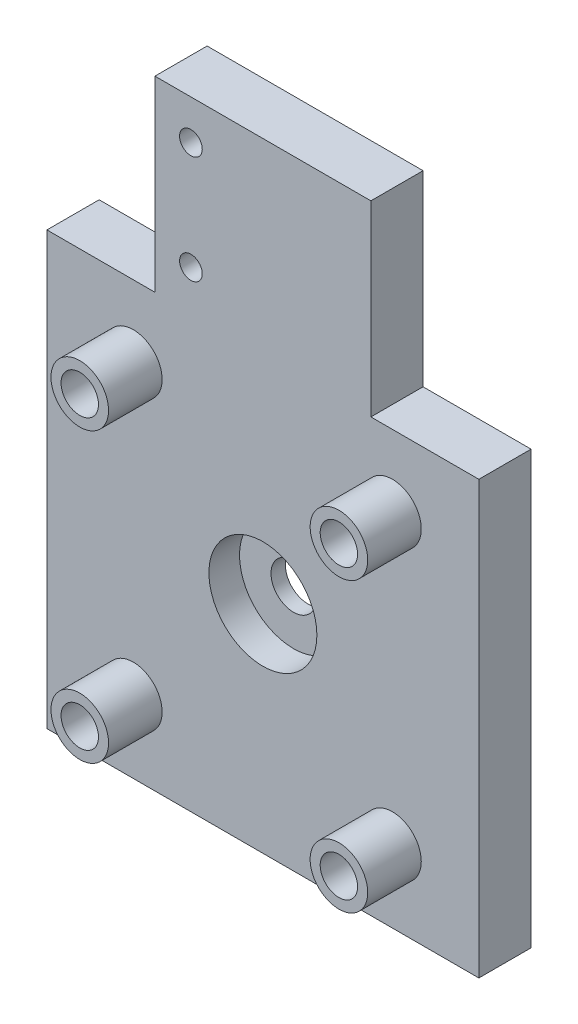
ISO-10303-21;
HEADER;
FILE_DESCRIPTION(('STEP AP214'),'2;1');
FILE_NAME('part.step','',(''),(''),'','','');
FILE_SCHEMA(('AUTOMOTIVE_DESIGN { 1 0 10303 214 1 1 1 1 }'));
ENDSEC;
DATA;
#1=APPLICATION_CONTEXT('core data for automotive mechanical design processes');
#2=APPLICATION_PROTOCOL_DEFINITION('international standard','automotive_design',2000,#1);
#3=PRODUCT_CONTEXT('',#1,'mechanical');
#4=PRODUCT('Part','Part','',(#3));
#5=PRODUCT_RELATED_PRODUCT_CATEGORY('part','',(#4));
#6=PRODUCT_DEFINITION_FORMATION('','',#4);
#7=PRODUCT_DEFINITION_CONTEXT('part definition',#1,'design');
#8=PRODUCT_DEFINITION('design','',#6,#7);
#9=PRODUCT_DEFINITION_SHAPE('','',#8);
#10=(LENGTH_UNIT() NAMED_UNIT(*) SI_UNIT(.MILLI.,.METRE.));
#11=(NAMED_UNIT(*) PLANE_ANGLE_UNIT() SI_UNIT($,.RADIAN.));
#12=(NAMED_UNIT(*) SI_UNIT($,.STERADIAN.) SOLID_ANGLE_UNIT());
#13=UNCERTAINTY_MEASURE_WITH_UNIT(LENGTH_MEASURE(1.E-05),#10,'distance_accuracy_value','');
#14=(GEOMETRIC_REPRESENTATION_CONTEXT(3) GLOBAL_UNCERTAINTY_ASSIGNED_CONTEXT((#13)) GLOBAL_UNIT_ASSIGNED_CONTEXT((#10,
#11,#12)) REPRESENTATION_CONTEXT('',''));
#15=CARTESIAN_POINT('',(0.,0.,0.));
#16=DIRECTION('',(0.,0.,1.));
#17=DIRECTION('',(1.,0.,0.));
#18=AXIS2_PLACEMENT_3D('',#15,#16,#17);
#19=CARTESIAN_POINT('',(-19.05,38.1,7.9375));
#20=DIRECTION('',(0.,-1.,0.));
#21=DIRECTION('',(0.,0.,-1.));
#22=AXIS2_PLACEMENT_3D('',#19,#20,#21);
#23=PLANE('',#22);
#24=DIRECTION('',(0.,0.,1.));
#25=VECTOR('',#24,1.);
#26=CARTESIAN_POINT('',(-19.05,38.1,-50.4175604328492));
#27=LINE('',#26,#25);
#28=CARTESIAN_POINT('',(-19.05,38.1,-1.27));
#29=VERTEX_POINT('',#28);
#30=CARTESIAN_POINT('',(-19.05,38.1,7.9375));
#31=VERTEX_POINT('',#30);
#32=EDGE_CURVE('E396',#29,#31,#27,.T.);
#33=ORIENTED_EDGE('',*,*,#32,.F.);
#34=DIRECTION('',(1.,0.,0.));
#35=VECTOR('',#34,1.);
#36=CARTESIAN_POINT('',(-38.1,38.1,-1.27));
#37=LINE('',#36,#35);
#38=CARTESIAN_POINT('',(-38.1,38.1,-1.27));
#39=VERTEX_POINT('',#38);
#40=EDGE_CURVE('E387',#39,#29,#37,.T.);
#41=ORIENTED_EDGE('',*,*,#40,.F.);
#42=DIRECTION('',(0.,0.,1.));
#43=VECTOR('',#42,1.);
#44=CARTESIAN_POINT('',(-38.1,38.1,-78.5451621680164));
#45=LINE('',#44,#43);
#46=CARTESIAN_POINT('',(-38.1,38.1,7.9375));
#47=VERTEX_POINT('',#46);
#48=EDGE_CURVE('E451',#39,#47,#45,.T.);
#49=ORIENTED_EDGE('',*,*,#48,.T.);
#50=DIRECTION('',(-1.,0.,0.));
#51=VECTOR('',#50,1.);
#52=CARTESIAN_POINT('',(-19.05,38.1,7.9375));
#53=LINE('',#52,#51);
#54=EDGE_CURVE('E475',#31,#47,#53,.T.);
#55=ORIENTED_EDGE('',*,*,#54,.F.);
#56=EDGE_LOOP('',(#33,#41,#49,#55));
#57=FACE_BOUND('',#56,.T.);
#58=ADVANCED_FACE('F238',(#57),#23,.F.);
#59=DIRECTION('',(0.,0.,1.));
#60=VECTOR('',#59,1.);
#61=CARTESIAN_POINT('',(38.1,38.1,-78.5451621680164));
#62=LINE('',#61,#60);
#63=CARTESIAN_POINT('',(38.1,38.1,-1.27));
#64=VERTEX_POINT('',#63);
#65=CARTESIAN_POINT('',(38.1,38.1,7.9375));
#66=VERTEX_POINT('',#65);
#67=EDGE_CURVE('E445',#64,#66,#62,.T.);
#68=ORIENTED_EDGE('',*,*,#67,.F.);
#69=DIRECTION('',(1.,0.,0.));
#70=VECTOR('',#69,1.);
#71=CARTESIAN_POINT('',(19.05,38.1,-1.27));
#72=LINE('',#71,#70);
#73=CARTESIAN_POINT('',(19.05,38.1,-1.27));
#74=VERTEX_POINT('',#73);
#75=EDGE_CURVE('E375',#74,#64,#72,.T.);
#76=ORIENTED_EDGE('',*,*,#75,.F.);
#77=DIRECTION('',(0.,0.,1.));
#78=VECTOR('',#77,1.);
#79=CARTESIAN_POINT('',(19.05,38.1,-50.4175604328492));
#80=LINE('',#79,#78);
#81=CARTESIAN_POINT('',(19.05,38.1,7.9375));
#82=VERTEX_POINT('',#81);
#83=EDGE_CURVE('E409',#74,#82,#80,.T.);
#84=ORIENTED_EDGE('',*,*,#83,.T.);
#85=EDGE_CURVE('E476',#66,#82,#53,.T.);
#86=ORIENTED_EDGE('',*,*,#85,.F.);
#87=EDGE_LOOP('',(#68,#76,#84,#86));
#88=FACE_BOUND('',#87,.T.);
#89=ADVANCED_FACE('F240',(#88),#23,.F.);
#90=CARTESIAN_POINT('',(-19.05,-38.1,7.9375));
#91=DIRECTION('',(0.,1.,0.));
#92=DIRECTION('',(0.,0.,1.));
#93=AXIS2_PLACEMENT_3D('',#90,#91,#92);
#94=PLANE('',#93);
#95=DIRECTION('',(0.,0.,1.));
#96=VECTOR('',#95,1.);
#97=CARTESIAN_POINT('',(-38.1,-38.1,-78.5451621680164));
#98=LINE('',#97,#96);
#99=CARTESIAN_POINT('',(-38.1,-38.1,-1.27));
#100=VERTEX_POINT('',#99);
#101=CARTESIAN_POINT('',(-38.1,-38.1,7.9375));
#102=VERTEX_POINT('',#101);
#103=EDGE_CURVE('E453',#100,#102,#98,.T.);
#104=ORIENTED_EDGE('',*,*,#103,.F.);
#105=DIRECTION('',(-1.,0.,0.));
#106=VECTOR('',#105,1.);
#107=CARTESIAN_POINT('',(38.1,-38.1,-1.27));
#108=LINE('',#107,#106);
#109=CARTESIAN_POINT('',(38.1,-38.1,-1.27));
#110=VERTEX_POINT('',#109);
#111=EDGE_CURVE('E381',#110,#100,#108,.T.);
#112=ORIENTED_EDGE('',*,*,#111,.F.);
#113=DIRECTION('',(0.,0.,1.));
#114=VECTOR('',#113,1.);
#115=CARTESIAN_POINT('',(38.1,-38.1,-78.5451621680164));
#116=LINE('',#115,#114);
#117=CARTESIAN_POINT('',(38.1,-38.1,7.9375));
#118=VERTEX_POINT('',#117);
#119=EDGE_CURVE('E459',#110,#118,#116,.T.);
#120=ORIENTED_EDGE('',*,*,#119,.T.);
#121=DIRECTION('',(1.,0.,0.));
#122=VECTOR('',#121,1.);
#123=CARTESIAN_POINT('',(-19.05,-38.1,7.9375));
#124=LINE('',#123,#122);
#125=EDGE_CURVE('E479',#102,#118,#124,.T.);
#126=ORIENTED_EDGE('',*,*,#125,.F.);
#127=EDGE_LOOP('',(#104,#112,#120,#126));
#128=FACE_BOUND('',#127,.T.);
#129=ADVANCED_FACE('F491',(#128),#94,.F.);
#130=CARTESIAN_POINT('',(0.,0.,7.9375));
#131=DIRECTION('',(0.,0.,-1.));
#132=DIRECTION('',(-1.,0.,0.));
#133=AXIS2_PLACEMENT_3D('',#130,#131,#132);
#134=PLANE('',#133);
#135=CARTESIAN_POINT('',(22.86,-25.4,7.9375));
#136=DIRECTION('',(0.,0.,-1.));
#137=DIRECTION('',(1.,0.,0.));
#138=AXIS2_PLACEMENT_3D('',#135,#136,#137);
#139=CIRCLE('',#138,5.08);
#140=CARTESIAN_POINT('',(27.94,-25.4,7.9375));
#141=VERTEX_POINT('',#140);
#142=EDGE_CURVE('E428',#141,#141,#139,.T.);
#143=ORIENTED_EDGE('',*,*,#142,.T.);
#144=EDGE_LOOP('',(#143));
#145=FACE_BOUND('',#144,.T.);
#146=CARTESIAN_POINT('',(-22.86,-25.4,7.9375));
#147=DIRECTION('',(0.,0.,-1.));
#148=DIRECTION('',(-1.,0.,0.));
#149=AXIS2_PLACEMENT_3D('',#146,#147,#148);
#150=CIRCLE('',#149,5.08);
#151=CARTESIAN_POINT('',(-27.94,-25.4,7.9375));
#152=VERTEX_POINT('',#151);
#153=EDGE_CURVE('E421',#152,#152,#150,.T.);
#154=ORIENTED_EDGE('',*,*,#153,.T.);
#155=EDGE_LOOP('',(#154));
#156=FACE_BOUND('',#155,.T.);
#157=CARTESIAN_POINT('',(22.86,25.4,7.9375));
#158=DIRECTION('',(0.,0.,-1.));
#159=DIRECTION('',(-1.,0.,0.));
#160=AXIS2_PLACEMENT_3D('',#157,#158,#159);
#161=CIRCLE('',#160,5.08);
#162=CARTESIAN_POINT('',(17.78,25.4,7.9375));
#163=VERTEX_POINT('',#162);
#164=EDGE_CURVE('E13',#163,#163,#161,.F.);
#165=ORIENTED_EDGE('',*,*,#164,.F.);
#166=EDGE_LOOP('',(#165));
#167=FACE_BOUND('',#166,.T.);
#168=CARTESIAN_POINT('',(-22.86,25.4,7.9375));
#169=DIRECTION('',(0.,0.,-1.));
#170=DIRECTION('',(-1.,0.,0.));
#171=AXIS2_PLACEMENT_3D('',#168,#169,#170);
#172=CIRCLE('',#171,5.08);
#173=CARTESIAN_POINT('',(-27.94,25.4,7.9375));
#174=VERTEX_POINT('',#173);
#175=EDGE_CURVE('E246',#174,#174,#172,.F.);
#176=ORIENTED_EDGE('',*,*,#175,.F.);
#177=EDGE_LOOP('',(#176));
#178=FACE_BOUND('',#177,.T.);
#179=CARTESIAN_POINT('',(0.,0.,7.9375));
#180=DIRECTION('',(0.,0.,1.));
#181=DIRECTION('',(1.,0.,0.));
#182=AXIS2_PLACEMENT_3D('',#179,#180,#181);
#183=CIRCLE('',#182,9.525);
#184=CARTESIAN_POINT('',(9.525,0.,7.9375));
#185=VERTEX_POINT('',#184);
#186=EDGE_CURVE('E456',#185,#185,#183,.T.);
#187=ORIENTED_EDGE('',*,*,#186,.F.);
#188=EDGE_LOOP('',(#187));
#189=FACE_BOUND('',#188,.T.);
#190=ORIENTED_EDGE('',*,*,#125,.T.);
#191=DIRECTION('',(0.,1.,0.));
#192=VECTOR('',#191,1.);
#193=CARTESIAN_POINT('',(38.1,38.1,7.9375));
#194=LINE('',#193,#192);
#195=EDGE_CURVE('E452',#118,#66,#194,.T.);
#196=ORIENTED_EDGE('',*,*,#195,.T.);
#197=ORIENTED_EDGE('',*,*,#85,.T.);
#198=DIRECTION('',(0.,1.,0.));
#199=VECTOR('',#198,1.);
#200=CARTESIAN_POINT('',(19.05,38.1,7.9375));
#201=LINE('',#200,#199);
#202=CARTESIAN_POINT('',(19.05,71.12,7.9375));
#203=VERTEX_POINT('',#202);
#204=EDGE_CURVE('E261',#82,#203,#201,.T.);
#205=ORIENTED_EDGE('',*,*,#204,.T.);
#206=DIRECTION('',(-1.,0.,0.));
#207=VECTOR('',#206,1.);
#208=CARTESIAN_POINT('',(-19.05,71.12,7.9375));
#209=LINE('',#208,#207);
#210=CARTESIAN_POINT('',(-19.05,71.12,7.9375));
#211=VERTEX_POINT('',#210);
#212=EDGE_CURVE('E397',#203,#211,#209,.T.);
#213=ORIENTED_EDGE('',*,*,#212,.T.);
#214=DIRECTION('',(0.,-1.,0.));
#215=VECTOR('',#214,1.);
#216=CARTESIAN_POINT('',(-19.05,38.1,7.9375));
#217=LINE('',#216,#215);
#218=EDGE_CURVE('E402',#211,#31,#217,.T.);
#219=ORIENTED_EDGE('',*,*,#218,.T.);
#220=ORIENTED_EDGE('',*,*,#54,.T.);
#221=DIRECTION('',(0.,-1.,0.));
#222=VECTOR('',#221,1.);
#223=CARTESIAN_POINT('',(-38.1,38.1,7.9375));
#224=LINE('',#223,#222);
#225=EDGE_CURVE('E448',#47,#102,#224,.T.);
#226=ORIENTED_EDGE('',*,*,#225,.T.);
#227=EDGE_LOOP('',(#190,#196,#197,#205,#213,#219,#220,#226));
#228=FACE_BOUND('',#227,.T.);
#229=CARTESIAN_POINT('',(-12.7,45.085,7.9375));
#230=DIRECTION('',(0.,0.,1.));
#231=DIRECTION('',(-1.,0.,0.));
#232=AXIS2_PLACEMENT_3D('',#229,#230,#231);
#233=CIRCLE('',#232,2.);
#234=CARTESIAN_POINT('',(-14.7,45.085,7.9375));
#235=VERTEX_POINT('',#234);
#236=EDGE_CURVE('E405',#235,#235,#233,.T.);
#237=ORIENTED_EDGE('',*,*,#236,.F.);
#238=EDGE_LOOP('',(#237));
#239=FACE_BOUND('',#238,.T.);
#240=CARTESIAN_POINT('',(-12.7,64.135,7.9375));
#241=DIRECTION('',(0.,0.,1.));
#242=DIRECTION('',(1.,0.,0.));
#243=AXIS2_PLACEMENT_3D('',#240,#241,#242);
#244=CIRCLE('',#243,2.);
#245=CARTESIAN_POINT('',(-10.7,64.135,7.9375));
#246=VERTEX_POINT('',#245);
#247=EDGE_CURVE('E406',#246,#246,#244,.T.);
#248=ORIENTED_EDGE('',*,*,#247,.F.);
#249=EDGE_LOOP('',(#248));
#250=FACE_BOUND('',#249,.T.);
#251=ADVANCED_FACE('F487',(#145,#156,#167,#178,#189,#228,#239,#250),#134,.F.);
#252=CARTESIAN_POINT('',(0.,0.,0.));
#253=DIRECTION('',(0.,0.,-1.));
#254=DIRECTION('',(-1.,0.,0.));
#255=AXIS2_PLACEMENT_3D('',#252,#253,#254);
#256=PLANE('',#255);
#257=DIRECTION('',(-1.,0.,0.));
#258=VECTOR('',#257,1.);
#259=CARTESIAN_POINT('',(12.7,12.7,0.));
#260=LINE('',#259,#258);
#261=CARTESIAN_POINT('',(12.7,12.7,0.));
#262=VERTEX_POINT('',#261);
#263=CARTESIAN_POINT('',(-12.7,12.7,0.));
#264=VERTEX_POINT('',#263);
#265=EDGE_CURVE('E341',#262,#264,#260,.T.);
#266=ORIENTED_EDGE('',*,*,#265,.F.);
#267=DIRECTION('',(0.,1.,0.));
#268=VECTOR('',#267,1.);
#269=CARTESIAN_POINT('',(12.7,-12.7,0.));
#270=LINE('',#269,#268);
#271=CARTESIAN_POINT('',(12.7,-12.7,0.));
#272=VERTEX_POINT('',#271);
#273=EDGE_CURVE('E348',#272,#262,#270,.T.);
#274=ORIENTED_EDGE('',*,*,#273,.F.);
#275=DIRECTION('',(-1.,0.,0.));
#276=VECTOR('',#275,1.);
#277=CARTESIAN_POINT('',(12.7,-12.7,0.));
#278=LINE('',#277,#276);
#279=CARTESIAN_POINT('',(-12.7,-12.7,0.));
#280=VERTEX_POINT('',#279);
#281=EDGE_CURVE('E351',#272,#280,#278,.T.);
#282=ORIENTED_EDGE('',*,*,#281,.T.);
#283=DIRECTION('',(0.,1.,0.));
#284=VECTOR('',#283,1.);
#285=CARTESIAN_POINT('',(-12.7,-12.7,0.));
#286=LINE('',#285,#284);
#287=EDGE_CURVE('E360',#280,#264,#286,.T.);
#288=ORIENTED_EDGE('',*,*,#287,.T.);
#289=EDGE_LOOP('',(#266,#274,#282,#288));
#290=FACE_BOUND('',#289,.T.);
#291=CARTESIAN_POINT('',(0.,0.,0.));
#292=DIRECTION('',(0.,0.,1.));
#293=DIRECTION('',(1.,0.,0.));
#294=AXIS2_PLACEMENT_3D('',#291,#292,#293);
#295=CIRCLE('',#294,3.96875);
#296=CARTESIAN_POINT('',(3.96875,0.,0.));
#297=VERTEX_POINT('',#296);
#298=EDGE_CURVE('E472',#297,#297,#295,.T.);
#299=ORIENTED_EDGE('',*,*,#298,.T.);
#300=EDGE_LOOP('',(#299));
#301=FACE_BOUND('',#300,.T.);
#302=ADVANCED_FACE('F490',(#290,#301),#256,.T.);
#303=CARTESIAN_POINT('',(0.,0.,0.));
#304=DIRECTION('',(0.,0.,1.));
#305=DIRECTION('',(1.,0.,0.));
#306=AXIS2_PLACEMENT_3D('',#303,#304,#305);
#307=CYLINDRICAL_SURFACE('',#306,3.96875);
#308=CARTESIAN_POINT('',(0.,0.,2.54));
#309=DIRECTION('',(0.,0.,-1.));
#310=DIRECTION('',(-1.,0.,0.));
#311=AXIS2_PLACEMENT_3D('',#308,#309,#310);
#312=CIRCLE('',#311,3.96875);
#313=CARTESIAN_POINT('',(-3.96875,0.,2.54));
#314=VERTEX_POINT('',#313);
#315=EDGE_CURVE('E471',#314,#314,#312,.F.);
#316=ORIENTED_EDGE('',*,*,#315,.T.);
#317=EDGE_LOOP('',(#316));
#318=FACE_BOUND('',#317,.T.);
#319=ORIENTED_EDGE('',*,*,#298,.F.);
#320=EDGE_LOOP('',(#319));
#321=FACE_BOUND('',#320,.T.);
#322=ADVANCED_FACE('F582',(#318,#321),#307,.F.);
#323=CARTESIAN_POINT('',(0.,0.,2.54));
#324=DIRECTION('',(0.,0.,-1.));
#325=DIRECTION('',(-1.,0.,0.));
#326=AXIS2_PLACEMENT_3D('',#323,#324,#325);
#327=PLANE('',#326);
#328=CARTESIAN_POINT('',(0.,0.,2.54));
#329=DIRECTION('',(0.,0.,-1.));
#330=DIRECTION('',(-1.,0.,0.));
#331=AXIS2_PLACEMENT_3D('',#328,#329,#330);
#332=CIRCLE('',#331,9.525);
#333=CARTESIAN_POINT('',(-9.525,0.,2.54));
#334=VERTEX_POINT('',#333);
#335=EDGE_CURVE('E468',#334,#334,#332,.F.);
#336=ORIENTED_EDGE('',*,*,#335,.T.);
#337=EDGE_LOOP('',(#336));
#338=FACE_BOUND('',#337,.T.);
#339=ORIENTED_EDGE('',*,*,#315,.F.);
#340=EDGE_LOOP('',(#339));
#341=FACE_BOUND('',#340,.T.);
#342=ADVANCED_FACE('F573',(#338,#341),#327,.F.);
#343=CARTESIAN_POINT('',(0.,0.,-26.9407683632075));
#344=DIRECTION('',(0.,0.,1.));
#345=DIRECTION('',(1.,0.,0.));
#346=AXIS2_PLACEMENT_3D('',#343,#344,#345);
#347=CYLINDRICAL_SURFACE('',#346,9.525);
#348=ORIENTED_EDGE('',*,*,#186,.T.);
#349=EDGE_LOOP('',(#348));
#350=FACE_BOUND('',#349,.T.);
#351=ORIENTED_EDGE('',*,*,#335,.F.);
#352=EDGE_LOOP('',(#351));
#353=FACE_BOUND('',#352,.T.);
#354=ADVANCED_FACE('F565',(#350,#353),#347,.F.);
#355=CARTESIAN_POINT('',(-38.1,38.1,-78.5451621680164));
#356=DIRECTION('',(-1.,0.,0.));
#357=DIRECTION('',(0.,-1.,0.));
#358=AXIS2_PLACEMENT_3D('',#355,#356,#357);
#359=PLANE('',#358);
#360=ORIENTED_EDGE('',*,*,#48,.F.);
#361=DIRECTION('',(0.,1.,0.));
#362=VECTOR('',#361,1.);
#363=CARTESIAN_POINT('',(-38.1,-38.1,-1.27));
#364=LINE('',#363,#362);
#365=EDGE_CURVE('E384',#100,#39,#364,.T.);
#366=ORIENTED_EDGE('',*,*,#365,.F.);
#367=ORIENTED_EDGE('',*,*,#103,.T.);
#368=ORIENTED_EDGE('',*,*,#225,.F.);
#369=EDGE_LOOP('',(#360,#366,#367,#368));
#370=FACE_BOUND('',#369,.T.);
#371=ADVANCED_FACE('F562',(#370),#359,.T.);
#372=CARTESIAN_POINT('',(38.1,38.1,-78.5451621680164));
#373=DIRECTION('',(1.,0.,0.));
#374=DIRECTION('',(0.,1.,0.));
#375=AXIS2_PLACEMENT_3D('',#372,#373,#374);
#376=PLANE('',#375);
#377=ORIENTED_EDGE('',*,*,#119,.F.);
#378=DIRECTION('',(0.,-1.,0.));
#379=VECTOR('',#378,1.);
#380=CARTESIAN_POINT('',(38.1,38.1,-1.27));
#381=LINE('',#380,#379);
#382=EDGE_CURVE('E378',#64,#110,#381,.T.);
#383=ORIENTED_EDGE('',*,*,#382,.F.);
#384=ORIENTED_EDGE('',*,*,#67,.T.);
#385=ORIENTED_EDGE('',*,*,#195,.F.);
#386=EDGE_LOOP('',(#377,#383,#384,#385));
#387=FACE_BOUND('',#386,.T.);
#388=ADVANCED_FACE('F558',(#387),#376,.T.);
#389=CARTESIAN_POINT('',(-22.86,25.4,17.3863));
#390=DIRECTION('',(0.,0.,-1.));
#391=DIRECTION('',(-1.,0.,0.));
#392=AXIS2_PLACEMENT_3D('',#389,#390,#391);
#393=CYLINDRICAL_SURFACE('',#392,5.08);
#394=CARTESIAN_POINT('',(-22.86,25.4,17.3863));
#395=DIRECTION('',(0.,0.,1.));
#396=DIRECTION('',(-1.,0.,0.));
#397=AXIS2_PLACEMENT_3D('',#394,#395,#396);
#398=CIRCLE('',#397,5.08);
#399=CARTESIAN_POINT('',(-27.94,25.4,17.3863));
#400=VERTEX_POINT('',#399);
#401=EDGE_CURVE('E439',#400,#400,#398,.T.);
#402=ORIENTED_EDGE('',*,*,#401,.F.);
#403=EDGE_LOOP('',(#402));
#404=FACE_BOUND('',#403,.T.);
#405=ORIENTED_EDGE('',*,*,#175,.T.);
#406=EDGE_LOOP('',(#405));
#407=FACE_BOUND('',#406,.T.);
#408=ADVANCED_FACE('F485',(#404,#407),#393,.T.);
#409=CARTESIAN_POINT('',(-22.86,25.4,17.3863));
#410=DIRECTION('',(0.,0.,-1.));
#411=DIRECTION('',(-1.,0.,0.));
#412=AXIS2_PLACEMENT_3D('',#409,#410,#411);
#413=PLANE('',#412);
#414=CARTESIAN_POINT('',(-22.86,25.4,17.3863));
#415=DIRECTION('',(0.,0.,1.));
#416=DIRECTION('',(-1.,0.,0.));
#417=AXIS2_PLACEMENT_3D('',#414,#415,#416);
#418=CIRCLE('',#417,3.302);
#419=CARTESIAN_POINT('',(-26.162,25.4,17.3863));
#420=VERTEX_POINT('',#419);
#421=EDGE_CURVE('E427',#420,#420,#418,.T.);
#422=ORIENTED_EDGE('',*,*,#421,.F.);
#423=EDGE_LOOP('',(#422));
#424=FACE_BOUND('',#423,.T.);
#425=ORIENTED_EDGE('',*,*,#401,.T.);
#426=EDGE_LOOP('',(#425));
#427=FACE_BOUND('',#426,.T.);
#428=ADVANCED_FACE('F577',(#424,#427),#413,.F.);
#429=CARTESIAN_POINT('',(22.86,25.4,17.3863));
#430=DIRECTION('',(0.,0.,-1.));
#431=DIRECTION('',(-1.,0.,0.));
#432=AXIS2_PLACEMENT_3D('',#429,#430,#431);
#433=CYLINDRICAL_SURFACE('',#432,5.08);
#434=CARTESIAN_POINT('',(22.86,25.4,17.3863));
#435=DIRECTION('',(0.,0.,1.));
#436=DIRECTION('',(1.,0.,0.));
#437=AXIS2_PLACEMENT_3D('',#434,#435,#436);
#438=CIRCLE('',#437,5.08);
#439=CARTESIAN_POINT('',(27.94,25.4,17.3863));
#440=VERTEX_POINT('',#439);
#441=EDGE_CURVE('E442',#440,#440,#438,.T.);
#442=ORIENTED_EDGE('',*,*,#441,.F.);
#443=EDGE_LOOP('',(#442));
#444=FACE_BOUND('',#443,.T.);
#445=ORIENTED_EDGE('',*,*,#164,.T.);
#446=EDGE_LOOP('',(#445));
#447=FACE_BOUND('',#446,.T.);
#448=ADVANCED_FACE('F727',(#444,#447),#433,.T.);
#449=CARTESIAN_POINT('',(22.86,25.4,17.3863));
#450=DIRECTION('',(0.,0.,1.));
#451=DIRECTION('',(1.,0.,0.));
#452=AXIS2_PLACEMENT_3D('',#449,#450,#451);
#453=PLANE('',#452);
#454=CARTESIAN_POINT('',(22.86,25.4,17.3863));
#455=DIRECTION('',(0.,0.,1.));
#456=DIRECTION('',(1.,0.,0.));
#457=AXIS2_PLACEMENT_3D('',#454,#455,#456);
#458=CIRCLE('',#457,3.302);
#459=CARTESIAN_POINT('',(26.162,25.4,17.3863));
#460=VERTEX_POINT('',#459);
#461=EDGE_CURVE('E436',#460,#460,#458,.T.);
#462=ORIENTED_EDGE('',*,*,#461,.F.);
#463=EDGE_LOOP('',(#462));
#464=FACE_BOUND('',#463,.T.);
#465=ORIENTED_EDGE('',*,*,#441,.T.);
#466=EDGE_LOOP('',(#465));
#467=FACE_BOUND('',#466,.T.);
#468=ADVANCED_FACE('F731',(#464,#467),#453,.T.);
#469=CARTESIAN_POINT('',(22.86,25.4,0.));
#470=DIRECTION('',(0.,0.,1.));
#471=DIRECTION('',(1.,0.,0.));
#472=AXIS2_PLACEMENT_3D('',#469,#470,#471);
#473=CYLINDRICAL_SURFACE('',#472,3.302);
#474=ORIENTED_EDGE('',*,*,#461,.T.);
#475=EDGE_LOOP('',(#474));
#476=FACE_BOUND('',#475,.T.);
#477=CARTESIAN_POINT('',(22.86,25.4,-1.27));
#478=DIRECTION('',(0.,0.,-1.));
#479=DIRECTION('',(-1.,0.,0.));
#480=AXIS2_PLACEMENT_3D('',#477,#478,#479);
#481=CIRCLE('',#480,3.302);
#482=CARTESIAN_POINT('',(19.558,25.4,-1.27));
#483=VERTEX_POINT('',#482);
#484=EDGE_CURVE('E366',#483,#483,#481,.T.);
#485=ORIENTED_EDGE('',*,*,#484,.T.);
#486=EDGE_LOOP('',(#485));
#487=FACE_BOUND('',#486,.T.);
#488=ADVANCED_FACE('F746',(#476,#487),#473,.F.);
#489=CARTESIAN_POINT('',(-22.86,25.4,0.));
#490=DIRECTION('',(0.,0.,1.));
#491=DIRECTION('',(1.,0.,0.));
#492=AXIS2_PLACEMENT_3D('',#489,#490,#491);
#493=CYLINDRICAL_SURFACE('',#492,3.302);
#494=ORIENTED_EDGE('',*,*,#421,.T.);
#495=EDGE_LOOP('',(#494));
#496=FACE_BOUND('',#495,.T.);
#497=CARTESIAN_POINT('',(-22.86,25.4,-1.27));
#498=DIRECTION('',(0.,0.,-1.));
#499=DIRECTION('',(-1.,0.,0.));
#500=AXIS2_PLACEMENT_3D('',#497,#498,#499);
#501=CIRCLE('',#500,3.302);
#502=CARTESIAN_POINT('',(-26.162,25.4,-1.27));
#503=VERTEX_POINT('',#502);
#504=EDGE_CURVE('E354',#503,#503,#501,.T.);
#505=ORIENTED_EDGE('',*,*,#504,.T.);
#506=EDGE_LOOP('',(#505));
#507=FACE_BOUND('',#506,.T.);
#508=ADVANCED_FACE('F758',(#496,#507),#493,.F.);
#509=CARTESIAN_POINT('',(-22.86,-25.4,17.3863));
#510=DIRECTION('',(0.,0.,-1.));
#511=DIRECTION('',(-1.,0.,0.));
#512=AXIS2_PLACEMENT_3D('',#509,#510,#511);
#513=CYLINDRICAL_SURFACE('',#512,5.08);
#514=CARTESIAN_POINT('',(-22.86,-25.4,17.3863));
#515=DIRECTION('',(0.,0.,-1.));
#516=DIRECTION('',(-1.,0.,0.));
#517=AXIS2_PLACEMENT_3D('',#514,#515,#516);
#518=CIRCLE('',#517,5.08);
#519=CARTESIAN_POINT('',(-27.94,-25.4,17.3863));
#520=VERTEX_POINT('',#519);
#521=EDGE_CURVE('E431',#520,#520,#518,.T.);
#522=ORIENTED_EDGE('',*,*,#521,.T.);
#523=EDGE_LOOP('',(#522));
#524=FACE_BOUND('',#523,.T.);
#525=ORIENTED_EDGE('',*,*,#153,.F.);
#526=EDGE_LOOP('',(#525));
#527=FACE_BOUND('',#526,.T.);
#528=ADVANCED_FACE('F753',(#524,#527),#513,.T.);
#529=CARTESIAN_POINT('',(-22.86,-25.4,17.3863));
#530=DIRECTION('',(0.,0.,-1.));
#531=DIRECTION('',(-1.,0.,0.));
#532=AXIS2_PLACEMENT_3D('',#529,#530,#531);
#533=PLANE('',#532);
#534=CARTESIAN_POINT('',(-22.86,-25.4,17.3863));
#535=DIRECTION('',(0.,0.,-1.));
#536=DIRECTION('',(-1.,0.,0.));
#537=AXIS2_PLACEMENT_3D('',#534,#535,#536);
#538=CIRCLE('',#537,3.302);
#539=CARTESIAN_POINT('',(-26.162,-25.4,17.3863));
#540=VERTEX_POINT('',#539);
#541=EDGE_CURVE('E400',#540,#540,#538,.T.);
#542=ORIENTED_EDGE('',*,*,#541,.T.);
#543=EDGE_LOOP('',(#542));
#544=FACE_BOUND('',#543,.T.);
#545=ORIENTED_EDGE('',*,*,#521,.F.);
#546=EDGE_LOOP('',(#545));
#547=FACE_BOUND('',#546,.T.);
#548=ADVANCED_FACE('F757',(#544,#547),#533,.F.);
#549=CARTESIAN_POINT('',(22.86,-25.4,17.3863));
#550=DIRECTION('',(0.,0.,-1.));
#551=DIRECTION('',(-1.,0.,0.));
#552=AXIS2_PLACEMENT_3D('',#549,#550,#551);
#553=CYLINDRICAL_SURFACE('',#552,5.08);
#554=CARTESIAN_POINT('',(22.86,-25.4,17.3863));
#555=DIRECTION('',(0.,0.,-1.));
#556=DIRECTION('',(1.,0.,0.));
#557=AXIS2_PLACEMENT_3D('',#554,#555,#556);
#558=CIRCLE('',#557,5.08);
#559=CARTESIAN_POINT('',(27.94,-25.4,17.3863));
#560=VERTEX_POINT('',#559);
#561=EDGE_CURVE('E424',#560,#560,#558,.T.);
#562=ORIENTED_EDGE('',*,*,#561,.T.);
#563=EDGE_LOOP('',(#562));
#564=FACE_BOUND('',#563,.T.);
#565=ORIENTED_EDGE('',*,*,#142,.F.);
#566=EDGE_LOOP('',(#565));
#567=FACE_BOUND('',#566,.T.);
#568=ADVANCED_FACE('F768',(#564,#567),#553,.T.);
#569=CARTESIAN_POINT('',(22.86,-25.4,17.3863));
#570=DIRECTION('',(0.,0.,1.));
#571=DIRECTION('',(1.,0.,0.));
#572=AXIS2_PLACEMENT_3D('',#569,#570,#571);
#573=PLANE('',#572);
#574=CARTESIAN_POINT('',(22.86,-25.4,17.3863));
#575=DIRECTION('',(0.,0.,-1.));
#576=DIRECTION('',(1.,0.,0.));
#577=AXIS2_PLACEMENT_3D('',#574,#575,#576);
#578=CIRCLE('',#577,3.302);
#579=CARTESIAN_POINT('',(26.162,-25.4,17.3863));
#580=VERTEX_POINT('',#579);
#581=EDGE_CURVE('E418',#580,#580,#578,.T.);
#582=ORIENTED_EDGE('',*,*,#581,.T.);
#583=EDGE_LOOP('',(#582));
#584=FACE_BOUND('',#583,.T.);
#585=ORIENTED_EDGE('',*,*,#561,.F.);
#586=EDGE_LOOP('',(#585));
#587=FACE_BOUND('',#586,.T.);
#588=ADVANCED_FACE('F777',(#584,#587),#573,.T.);
#589=CARTESIAN_POINT('',(22.86,-25.4,0.));
#590=DIRECTION('',(0.,0.,1.));
#591=DIRECTION('',(1.,0.,0.));
#592=AXIS2_PLACEMENT_3D('',#589,#590,#591);
#593=CYLINDRICAL_SURFACE('',#592,3.302);
#594=ORIENTED_EDGE('',*,*,#581,.F.);
#595=EDGE_LOOP('',(#594));
#596=FACE_BOUND('',#595,.T.);
#597=CARTESIAN_POINT('',(22.86,-25.4,-1.27));
#598=DIRECTION('',(0.,0.,-1.));
#599=DIRECTION('',(-1.,0.,0.));
#600=AXIS2_PLACEMENT_3D('',#597,#598,#599);
#601=CIRCLE('',#600,3.302);
#602=CARTESIAN_POINT('',(19.558,-25.4,-1.27));
#603=VERTEX_POINT('',#602);
#604=EDGE_CURVE('E516',#603,#603,#601,.T.);
#605=ORIENTED_EDGE('',*,*,#604,.T.);
#606=EDGE_LOOP('',(#605));
#607=FACE_BOUND('',#606,.T.);
#608=ADVANCED_FACE('F522',(#596,#607),#593,.F.);
#609=CARTESIAN_POINT('',(-22.86,-25.4,0.));
#610=DIRECTION('',(0.,0.,1.));
#611=DIRECTION('',(1.,0.,0.));
#612=AXIS2_PLACEMENT_3D('',#609,#610,#611);
#613=CYLINDRICAL_SURFACE('',#612,3.302);
#614=ORIENTED_EDGE('',*,*,#541,.F.);
#615=EDGE_LOOP('',(#614));
#616=FACE_BOUND('',#615,.T.);
#617=CARTESIAN_POINT('',(-22.86,-25.4,-1.27));
#618=DIRECTION('',(0.,0.,-1.));
#619=DIRECTION('',(-1.,0.,0.));
#620=AXIS2_PLACEMENT_3D('',#617,#618,#619);
#621=CIRCLE('',#620,3.302);
#622=CARTESIAN_POINT('',(-26.162,-25.4,-1.27));
#623=VERTEX_POINT('',#622);
#624=EDGE_CURVE('E512',#623,#623,#621,.T.);
#625=ORIENTED_EDGE('',*,*,#624,.T.);
#626=EDGE_LOOP('',(#625));
#627=FACE_BOUND('',#626,.T.);
#628=ADVANCED_FACE('F617',(#616,#627),#613,.F.);
#629=CARTESIAN_POINT('',(-19.05,38.1,-50.4175604328492));
#630=DIRECTION('',(-1.,0.,0.));
#631=DIRECTION('',(0.,0.,1.));
#632=AXIS2_PLACEMENT_3D('',#629,#630,#631);
#633=PLANE('',#632);
#634=DIRECTION('',(0.,0.,1.));
#635=VECTOR('',#634,1.);
#636=CARTESIAN_POINT('',(-19.05,71.12,-50.4175604328492));
#637=LINE('',#636,#635);
#638=CARTESIAN_POINT('',(-19.05,71.12,-1.27));
#639=VERTEX_POINT('',#638);
#640=EDGE_CURVE('E412',#639,#211,#637,.T.);
#641=ORIENTED_EDGE('',*,*,#640,.F.);
#642=DIRECTION('',(0.,1.,0.));
#643=VECTOR('',#642,1.);
#644=CARTESIAN_POINT('',(-19.05,38.1,-1.27));
#645=LINE('',#644,#643);
#646=EDGE_CURVE('E390',#29,#639,#645,.T.);
#647=ORIENTED_EDGE('',*,*,#646,.F.);
#648=ORIENTED_EDGE('',*,*,#32,.T.);
#649=ORIENTED_EDGE('',*,*,#218,.F.);
#650=EDGE_LOOP('',(#641,#647,#648,#649));
#651=FACE_BOUND('',#650,.T.);
#652=ADVANCED_FACE('F549',(#651),#633,.T.);
#653=CARTESIAN_POINT('',(-19.05,71.12,-50.4175604328492));
#654=DIRECTION('',(0.,1.,0.));
#655=DIRECTION('',(0.,0.,1.));
#656=AXIS2_PLACEMENT_3D('',#653,#654,#655);
#657=PLANE('',#656);
#658=DIRECTION('',(0.,0.,1.));
#659=VECTOR('',#658,1.);
#660=CARTESIAN_POINT('',(19.05,71.12,-50.4175604328492));
#661=LINE('',#660,#659);
#662=CARTESIAN_POINT('',(19.05,71.12,-1.27));
#663=VERTEX_POINT('',#662);
#664=EDGE_CURVE('E414',#663,#203,#661,.T.);
#665=ORIENTED_EDGE('',*,*,#664,.F.);
#666=DIRECTION('',(1.,0.,0.));
#667=VECTOR('',#666,1.);
#668=CARTESIAN_POINT('',(-19.05,71.12,-1.27));
#669=LINE('',#668,#667);
#670=EDGE_CURVE('E393',#639,#663,#669,.T.);
#671=ORIENTED_EDGE('',*,*,#670,.F.);
#672=ORIENTED_EDGE('',*,*,#640,.T.);
#673=ORIENTED_EDGE('',*,*,#212,.F.);
#674=EDGE_LOOP('',(#665,#671,#672,#673));
#675=FACE_BOUND('',#674,.T.);
#676=ADVANCED_FACE('F552',(#675),#657,.T.);
#677=CARTESIAN_POINT('',(19.05,38.1,-50.4175604328492));
#678=DIRECTION('',(1.,0.,0.));
#679=DIRECTION('',(0.,0.,-1.));
#680=AXIS2_PLACEMENT_3D('',#677,#678,#679);
#681=PLANE('',#680);
#682=ORIENTED_EDGE('',*,*,#83,.F.);
#683=DIRECTION('',(0.,-1.,0.));
#684=VECTOR('',#683,1.);
#685=CARTESIAN_POINT('',(19.05,71.12,-1.27));
#686=LINE('',#685,#684);
#687=EDGE_CURVE('E372',#663,#74,#686,.T.);
#688=ORIENTED_EDGE('',*,*,#687,.F.);
#689=ORIENTED_EDGE('',*,*,#664,.T.);
#690=ORIENTED_EDGE('',*,*,#204,.F.);
#691=EDGE_LOOP('',(#682,#688,#689,#690));
#692=FACE_BOUND('',#691,.T.);
#693=ADVANCED_FACE('F505',(#692),#681,.T.);
#694=CARTESIAN_POINT('',(-12.7,64.135,-50.4175604328492));
#695=DIRECTION('',(0.,0.,1.));
#696=DIRECTION('',(1.,0.,0.));
#697=AXIS2_PLACEMENT_3D('',#694,#695,#696);
#698=CYLINDRICAL_SURFACE('',#697,2.);
#699=ORIENTED_EDGE('',*,*,#247,.T.);
#700=EDGE_LOOP('',(#699));
#701=FACE_BOUND('',#700,.T.);
#702=CARTESIAN_POINT('',(-12.7,64.135,-1.27));
#703=DIRECTION('',(0.,0.,-1.));
#704=DIRECTION('',(-1.,0.,0.));
#705=AXIS2_PLACEMENT_3D('',#702,#703,#704);
#706=CIRCLE('',#705,2.);
#707=CARTESIAN_POINT('',(-14.7,64.135,-1.27));
#708=VERTEX_POINT('',#707);
#709=EDGE_CURVE('E509',#708,#708,#706,.T.);
#710=ORIENTED_EDGE('',*,*,#709,.T.);
#711=EDGE_LOOP('',(#710));
#712=FACE_BOUND('',#711,.T.);
#713=ADVANCED_FACE('F501',(#701,#712),#698,.F.);
#714=CARTESIAN_POINT('',(-12.7,45.085,-50.4175604328492));
#715=DIRECTION('',(0.,0.,1.));
#716=DIRECTION('',(1.,0.,0.));
#717=AXIS2_PLACEMENT_3D('',#714,#715,#716);
#718=CYLINDRICAL_SURFACE('',#717,2.);
#719=ORIENTED_EDGE('',*,*,#236,.T.);
#720=EDGE_LOOP('',(#719));
#721=FACE_BOUND('',#720,.T.);
#722=CARTESIAN_POINT('',(-12.7,45.085,-1.27));
#723=DIRECTION('',(0.,0.,-1.));
#724=DIRECTION('',(-1.,0.,0.));
#725=AXIS2_PLACEMENT_3D('',#722,#723,#724);
#726=CIRCLE('',#725,2.);
#727=CARTESIAN_POINT('',(-14.7,45.085,-1.27));
#728=VERTEX_POINT('',#727);
#729=EDGE_CURVE('E511',#728,#728,#726,.T.);
#730=ORIENTED_EDGE('',*,*,#729,.T.);
#731=EDGE_LOOP('',(#730));
#732=FACE_BOUND('',#731,.T.);
#733=ADVANCED_FACE('F504',(#721,#732),#718,.F.);
#734=CARTESIAN_POINT('',(0.,0.,-1.27));
#735=DIRECTION('',(0.,0.,1.));
#736=DIRECTION('',(1.,0.,0.));
#737=AXIS2_PLACEMENT_3D('',#734,#735,#736);
#738=PLANE('',#737);
#739=DIRECTION('',(0.,1.,0.));
#740=VECTOR('',#739,1.);
#741=CARTESIAN_POINT('',(12.7,-12.7,-1.27));
#742=LINE('',#741,#740);
#743=CARTESIAN_POINT('',(12.7,-12.7,-1.27));
#744=VERTEX_POINT('',#743);
#745=CARTESIAN_POINT('',(12.7,12.7,-1.27));
#746=VERTEX_POINT('',#745);
#747=EDGE_CURVE('E343',#744,#746,#742,.T.);
#748=ORIENTED_EDGE('',*,*,#747,.T.);
#749=DIRECTION('',(-1.,0.,0.));
#750=VECTOR('',#749,1.);
#751=CARTESIAN_POINT('',(12.7,12.7,-1.27));
#752=LINE('',#751,#750);
#753=CARTESIAN_POINT('',(-12.7,12.7,-1.27));
#754=VERTEX_POINT('',#753);
#755=EDGE_CURVE('E334',#746,#754,#752,.T.);
#756=ORIENTED_EDGE('',*,*,#755,.T.);
#757=DIRECTION('',(0.,1.,0.));
#758=VECTOR('',#757,1.);
#759=CARTESIAN_POINT('',(-12.7,-12.7,-1.27));
#760=LINE('',#759,#758);
#761=CARTESIAN_POINT('',(-12.7,-12.7,-1.27));
#762=VERTEX_POINT('',#761);
#763=EDGE_CURVE('E326',#762,#754,#760,.T.);
#764=ORIENTED_EDGE('',*,*,#763,.F.);
#765=DIRECTION('',(-1.,0.,0.));
#766=VECTOR('',#765,1.);
#767=CARTESIAN_POINT('',(12.7,-12.7,-1.27));
#768=LINE('',#767,#766);
#769=EDGE_CURVE('E333',#744,#762,#768,.T.);
#770=ORIENTED_EDGE('',*,*,#769,.F.);
#771=EDGE_LOOP('',(#748,#756,#764,#770));
#772=FACE_BOUND('',#771,.T.);
#773=ORIENTED_EDGE('',*,*,#687,.T.);
#774=ORIENTED_EDGE('',*,*,#75,.T.);
#775=ORIENTED_EDGE('',*,*,#382,.T.);
#776=ORIENTED_EDGE('',*,*,#111,.T.);
#777=ORIENTED_EDGE('',*,*,#365,.T.);
#778=ORIENTED_EDGE('',*,*,#40,.T.);
#779=ORIENTED_EDGE('',*,*,#646,.T.);
#780=ORIENTED_EDGE('',*,*,#670,.T.);
#781=EDGE_LOOP('',(#773,#774,#775,#776,#777,#778,#779,#780));
#782=FACE_BOUND('',#781,.T.);
#783=ORIENTED_EDGE('',*,*,#484,.F.);
#784=EDGE_LOOP('',(#783));
#785=FACE_BOUND('',#784,.T.);
#786=ORIENTED_EDGE('',*,*,#504,.F.);
#787=EDGE_LOOP('',(#786));
#788=FACE_BOUND('',#787,.T.);
#789=ORIENTED_EDGE('',*,*,#729,.F.);
#790=EDGE_LOOP('',(#789));
#791=FACE_BOUND('',#790,.T.);
#792=ORIENTED_EDGE('',*,*,#709,.F.);
#793=EDGE_LOOP('',(#792));
#794=FACE_BOUND('',#793,.T.);
#795=ORIENTED_EDGE('',*,*,#624,.F.);
#796=EDGE_LOOP('',(#795));
#797=FACE_BOUND('',#796,.T.);
#798=ORIENTED_EDGE('',*,*,#604,.F.);
#799=EDGE_LOOP('',(#798));
#800=FACE_BOUND('',#799,.T.);
#801=ADVANCED_FACE('F345',(#772,#782,#785,#788,#791,#794,#797,#800),#738,.F.);
#802=CARTESIAN_POINT('',(12.7,12.7,-1.27));
#803=DIRECTION('',(0.,1.,0.));
#804=DIRECTION('',(0.,0.,1.));
#805=AXIS2_PLACEMENT_3D('',#802,#803,#804);
#806=PLANE('',#805);
#807=ORIENTED_EDGE('',*,*,#265,.T.);
#808=DIRECTION('',(0.,0.,1.));
#809=VECTOR('',#808,1.);
#810=CARTESIAN_POINT('',(-12.7,12.7,-1.27));
#811=LINE('',#810,#809);
#812=EDGE_CURVE('E253',#754,#264,#811,.T.);
#813=ORIENTED_EDGE('',*,*,#812,.F.);
#814=ORIENTED_EDGE('',*,*,#755,.F.);
#815=DIRECTION('',(0.,0.,1.));
#816=VECTOR('',#815,1.);
#817=CARTESIAN_POINT('',(12.7,12.7,-1.27));
#818=LINE('',#817,#816);
#819=EDGE_CURVE('E364',#746,#262,#818,.T.);
#820=ORIENTED_EDGE('',*,*,#819,.T.);
#821=EDGE_LOOP('',(#807,#813,#814,#820));
#822=FACE_BOUND('',#821,.T.);
#823=ADVANCED_FACE('F338',(#822),#806,.F.);
#824=CARTESIAN_POINT('',(12.7,-12.7,-1.27));
#825=DIRECTION('',(1.,0.,0.));
#826=DIRECTION('',(0.,0.,-1.));
#827=AXIS2_PLACEMENT_3D('',#824,#825,#826);
#828=PLANE('',#827);
#829=ORIENTED_EDGE('',*,*,#273,.T.);
#830=ORIENTED_EDGE('',*,*,#819,.F.);
#831=ORIENTED_EDGE('',*,*,#747,.F.);
#832=DIRECTION('',(0.,0.,1.));
#833=VECTOR('',#832,1.);
#834=CARTESIAN_POINT('',(12.7,-12.7,-1.27));
#835=LINE('',#834,#833);
#836=EDGE_CURVE('E367',#744,#272,#835,.T.);
#837=ORIENTED_EDGE('',*,*,#836,.T.);
#838=EDGE_LOOP('',(#829,#830,#831,#837));
#839=FACE_BOUND('',#838,.T.);
#840=ADVANCED_FACE('F530',(#839),#828,.F.);
#841=CARTESIAN_POINT('',(12.7,-12.7,-1.27));
#842=DIRECTION('',(0.,1.,0.));
#843=DIRECTION('',(0.,0.,1.));
#844=AXIS2_PLACEMENT_3D('',#841,#842,#843);
#845=PLANE('',#844);
#846=ORIENTED_EDGE('',*,*,#281,.F.);
#847=ORIENTED_EDGE('',*,*,#836,.F.);
#848=ORIENTED_EDGE('',*,*,#769,.T.);
#849=DIRECTION('',(0.,0.,1.));
#850=VECTOR('',#849,1.);
#851=CARTESIAN_POINT('',(-12.7,-12.7,-1.27));
#852=LINE('',#851,#850);
#853=EDGE_CURVE('E328',#762,#280,#852,.T.);
#854=ORIENTED_EDGE('',*,*,#853,.T.);
#855=EDGE_LOOP('',(#846,#847,#848,#854));
#856=FACE_BOUND('',#855,.T.);
#857=ADVANCED_FACE('F921',(#856),#845,.T.);
#858=CARTESIAN_POINT('',(-12.7,-12.7,-1.27));
#859=DIRECTION('',(1.,0.,0.));
#860=DIRECTION('',(0.,0.,-1.));
#861=AXIS2_PLACEMENT_3D('',#858,#859,#860);
#862=PLANE('',#861);
#863=ORIENTED_EDGE('',*,*,#287,.F.);
#864=ORIENTED_EDGE('',*,*,#853,.F.);
#865=ORIENTED_EDGE('',*,*,#763,.T.);
#866=ORIENTED_EDGE('',*,*,#812,.T.);
#867=EDGE_LOOP('',(#863,#864,#865,#866));
#868=FACE_BOUND('',#867,.T.);
#869=ADVANCED_FACE('F327',(#868),#862,.T.);
#870=CLOSED_SHELL('',(#58,#89,#129,#251,#302,#322,#342,#354,#371,#388,#408,#428,#448,#468,#488,
#508,#528,#548,#568,#588,#608,#628,#652,#676,#693,#713,#733,#801,#823,#840,#857,#869));
#871=MANIFOLD_SOLID_BREP('B2',#870);
#872=ADVANCED_BREP_SHAPE_REPRESENTATION('',(#18,#871),#14);
#873=SHAPE_DEFINITION_REPRESENTATION(#9,#872);
ENDSEC;
END-ISO-10303-21;
